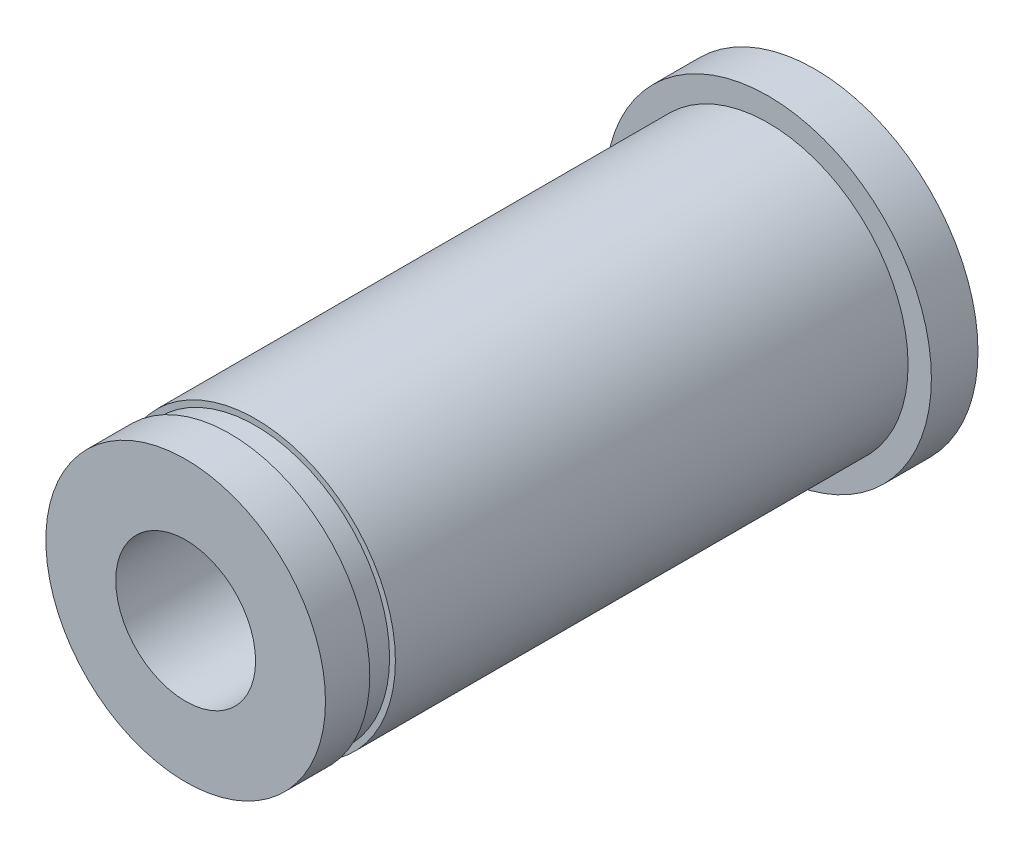
ISO-10303-21;
HEADER;
FILE_DESCRIPTION(('STEP AP214'),'2;1');
FILE_NAME('part.step','',(''),(''),'','','');
FILE_SCHEMA(('AUTOMOTIVE_DESIGN { 1 0 10303 214 1 1 1 1 }'));
ENDSEC;
DATA;
#1=APPLICATION_CONTEXT('core data for automotive mechanical design processes');
#2=APPLICATION_PROTOCOL_DEFINITION('international standard','automotive_design',2000,#1);
#3=PRODUCT_CONTEXT('',#1,'mechanical');
#4=PRODUCT('Part','Part','',(#3));
#5=PRODUCT_RELATED_PRODUCT_CATEGORY('part','',(#4));
#6=PRODUCT_DEFINITION_FORMATION('','',#4);
#7=PRODUCT_DEFINITION_CONTEXT('part definition',#1,'design');
#8=PRODUCT_DEFINITION('design','',#6,#7);
#9=PRODUCT_DEFINITION_SHAPE('','',#8);
#10=(LENGTH_UNIT() NAMED_UNIT(*) SI_UNIT(.MILLI.,.METRE.));
#11=(NAMED_UNIT(*) PLANE_ANGLE_UNIT() SI_UNIT($,.RADIAN.));
#12=(NAMED_UNIT(*) SI_UNIT($,.STERADIAN.) SOLID_ANGLE_UNIT());
#13=UNCERTAINTY_MEASURE_WITH_UNIT(LENGTH_MEASURE(1.E-05),#10,'distance_accuracy_value','');
#14=(GEOMETRIC_REPRESENTATION_CONTEXT(3) GLOBAL_UNCERTAINTY_ASSIGNED_CONTEXT((#13)) GLOBAL_UNIT_ASSIGNED_CONTEXT((#10,
#11,#12)) REPRESENTATION_CONTEXT('',''));
#15=CARTESIAN_POINT('',(0.,0.,0.));
#16=DIRECTION('',(0.,0.,1.));
#17=DIRECTION('',(1.,0.,0.));
#18=AXIS2_PLACEMENT_3D('',#15,#16,#17);
#19=CARTESIAN_POINT('',(0.,0.,25.));
#20=DIRECTION('',(0.,0.,-1.));
#21=DIRECTION('',(-1.,0.,0.));
#22=AXIS2_PLACEMENT_3D('',#19,#20,#21);
#23=CYLINDRICAL_SURFACE('',#22,6.);
#24=CARTESIAN_POINT('',(0.,0.,0.));
#25=DIRECTION('',(0.,0.,1.));
#26=DIRECTION('',(1.,0.,0.));
#27=AXIS2_PLACEMENT_3D('',#24,#25,#26);
#28=CIRCLE('',#27,6.);
#29=CARTESIAN_POINT('',(6.,0.,0.));
#30=VERTEX_POINT('',#29);
#31=EDGE_CURVE('E40',#30,#30,#28,.T.);
#32=ORIENTED_EDGE('',*,*,#31,.T.);
#33=EDGE_LOOP('',(#32));
#34=FACE_BOUND('',#33,.T.);
#35=CARTESIAN_POINT('',(0.,0.,22.));
#36=DIRECTION('',(0.,0.,1.));
#37=DIRECTION('',(1.,0.,0.));
#38=AXIS2_PLACEMENT_3D('',#35,#36,#37);
#39=CIRCLE('',#38,6.);
#40=CARTESIAN_POINT('',(6.,0.,22.));
#41=VERTEX_POINT('',#40);
#42=EDGE_CURVE('E61',#41,#41,#39,.T.);
#43=ORIENTED_EDGE('',*,*,#42,.F.);
#44=EDGE_LOOP('',(#43));
#45=FACE_BOUND('',#44,.T.);
#46=ADVANCED_FACE('F32',(#34,#45),#23,.T.);
#47=CARTESIAN_POINT('',(0.,0.,-2.));
#48=DIRECTION('',(0.,0.,1.));
#49=DIRECTION('',(1.,0.,0.));
#50=AXIS2_PLACEMENT_3D('',#47,#48,#49);
#51=CYLINDRICAL_SURFACE('',#50,7.);
#52=CARTESIAN_POINT('',(0.,0.,-2.));
#53=DIRECTION('',(0.,0.,-1.));
#54=DIRECTION('',(-1.,0.,0.));
#55=AXIS2_PLACEMENT_3D('',#52,#53,#54);
#56=CIRCLE('',#55,7.);
#57=CARTESIAN_POINT('',(-7.,0.,-2.));
#58=VERTEX_POINT('',#57);
#59=EDGE_CURVE('E45',#58,#58,#56,.T.);
#60=ORIENTED_EDGE('',*,*,#59,.F.);
#61=EDGE_LOOP('',(#60));
#62=FACE_BOUND('',#61,.T.);
#63=CARTESIAN_POINT('',(0.,0.,0.));
#64=DIRECTION('',(0.,0.,-1.));
#65=DIRECTION('',(-1.,0.,0.));
#66=AXIS2_PLACEMENT_3D('',#63,#64,#65);
#67=CIRCLE('',#66,7.);
#68=CARTESIAN_POINT('',(-7.,0.,0.));
#69=VERTEX_POINT('',#68);
#70=EDGE_CURVE('E47',#69,#69,#67,.T.);
#71=ORIENTED_EDGE('',*,*,#70,.T.);
#72=EDGE_LOOP('',(#71));
#73=FACE_BOUND('',#72,.T.);
#74=ADVANCED_FACE('F86',(#62,#73),#51,.T.);
#75=CARTESIAN_POINT('',(0.,0.,-2.));
#76=DIRECTION('',(0.,0.,-1.));
#77=DIRECTION('',(-1.,0.,0.));
#78=AXIS2_PLACEMENT_3D('',#75,#76,#77);
#79=PLANE('',#78);
#80=CARTESIAN_POINT('',(0.,0.,-2.));
#81=DIRECTION('',(0.,0.,-1.));
#82=DIRECTION('',(-1.,0.,0.));
#83=AXIS2_PLACEMENT_3D('',#80,#81,#82);
#84=CIRCLE('',#83,3.);
#85=CARTESIAN_POINT('',(-3.,0.,-2.));
#86=VERTEX_POINT('',#85);
#87=EDGE_CURVE('E64',#86,#86,#84,.T.);
#88=ORIENTED_EDGE('',*,*,#87,.F.);
#89=EDGE_LOOP('',(#88));
#90=FACE_BOUND('',#89,.T.);
#91=ORIENTED_EDGE('',*,*,#59,.T.);
#92=EDGE_LOOP('',(#91));
#93=FACE_BOUND('',#92,.T.);
#94=ADVANCED_FACE('F91',(#90,#93),#79,.T.);
#95=CARTESIAN_POINT('',(0.,0.,0.));
#96=DIRECTION('',(0.,0.,-1.));
#97=DIRECTION('',(-1.,0.,0.));
#98=AXIS2_PLACEMENT_3D('',#95,#96,#97);
#99=PLANE('',#98);
#100=ORIENTED_EDGE('',*,*,#31,.F.);
#101=EDGE_LOOP('',(#100));
#102=FACE_BOUND('',#101,.T.);
#103=ORIENTED_EDGE('',*,*,#70,.F.);
#104=EDGE_LOOP('',(#103));
#105=FACE_BOUND('',#104,.T.);
#106=ADVANCED_FACE('F107',(#102,#105),#99,.F.);
#107=CARTESIAN_POINT('',(-6.,0.,23.1));
#108=DIRECTION('',(0.,0.,-1.));
#109=DIRECTION('',(-1.,0.,0.));
#110=AXIS2_PLACEMENT_3D('',#107,#108,#109);
#111=PLANE('',#110);
#112=CARTESIAN_POINT('',(0.,0.,23.1));
#113=DIRECTION('',(0.,0.,1.));
#114=DIRECTION('',(1.,0.,0.));
#115=AXIS2_PLACEMENT_3D('',#112,#113,#114);
#116=CIRCLE('',#115,5.75);
#117=CARTESIAN_POINT('',(5.75,0.,23.1));
#118=VERTEX_POINT('',#117);
#119=EDGE_CURVE('E55',#118,#118,#116,.T.);
#120=ORIENTED_EDGE('',*,*,#119,.T.);
#121=EDGE_LOOP('',(#120));
#122=FACE_BOUND('',#121,.T.);
#123=CARTESIAN_POINT('',(0.,0.,23.1));
#124=DIRECTION('',(0.,0.,1.));
#125=DIRECTION('',(1.,0.,0.));
#126=AXIS2_PLACEMENT_3D('',#123,#124,#125);
#127=CIRCLE('',#126,6.);
#128=CARTESIAN_POINT('',(6.,0.,23.1));
#129=VERTEX_POINT('',#128);
#130=EDGE_CURVE('E50',#129,#129,#127,.T.);
#131=ORIENTED_EDGE('',*,*,#130,.F.);
#132=EDGE_LOOP('',(#131));
#133=FACE_BOUND('',#132,.T.);
#134=ADVANCED_FACE('F101',(#122,#133),#111,.T.);
#135=CARTESIAN_POINT('',(0.,0.,25.));
#136=DIRECTION('',(0.,0.,1.));
#137=DIRECTION('',(1.,0.,0.));
#138=AXIS2_PLACEMENT_3D('',#135,#136,#137);
#139=CYLINDRICAL_SURFACE('',#138,5.75);
#140=CARTESIAN_POINT('',(0.,0.,22.));
#141=DIRECTION('',(0.,0.,1.));
#142=DIRECTION('',(1.,0.,0.));
#143=AXIS2_PLACEMENT_3D('',#140,#141,#142);
#144=CIRCLE('',#143,5.75);
#145=CARTESIAN_POINT('',(5.75,0.,22.));
#146=VERTEX_POINT('',#145);
#147=EDGE_CURVE('E58',#146,#146,#144,.T.);
#148=ORIENTED_EDGE('',*,*,#147,.T.);
#149=EDGE_LOOP('',(#148));
#150=FACE_BOUND('',#149,.T.);
#151=ORIENTED_EDGE('',*,*,#119,.F.);
#152=EDGE_LOOP('',(#151));
#153=FACE_BOUND('',#152,.T.);
#154=ADVANCED_FACE('F81',(#150,#153),#139,.T.);
#155=CARTESIAN_POINT('',(-6.,0.,22.));
#156=DIRECTION('',(0.,0.,1.));
#157=DIRECTION('',(1.,0.,0.));
#158=AXIS2_PLACEMENT_3D('',#155,#156,#157);
#159=PLANE('',#158);
#160=ORIENTED_EDGE('',*,*,#42,.T.);
#161=EDGE_LOOP('',(#160));
#162=FACE_BOUND('',#161,.T.);
#163=ORIENTED_EDGE('',*,*,#147,.F.);
#164=EDGE_LOOP('',(#163));
#165=FACE_BOUND('',#164,.T.);
#166=ADVANCED_FACE('F75',(#162,#165),#159,.T.);
#167=CARTESIAN_POINT('',(0.,0.,25.));
#168=DIRECTION('',(0.,0.,1.));
#169=DIRECTION('',(1.,0.,0.));
#170=AXIS2_PLACEMENT_3D('',#167,#168,#169);
#171=PLANE('',#170);
#172=CARTESIAN_POINT('',(0.,0.,25.));
#173=DIRECTION('',(0.,0.,1.));
#174=DIRECTION('',(1.,0.,0.));
#175=AXIS2_PLACEMENT_3D('',#172,#173,#174);
#176=CIRCLE('',#175,3.);
#177=CARTESIAN_POINT('',(3.,0.,25.));
#178=VERTEX_POINT('',#177);
#179=EDGE_CURVE('E36',#178,#178,#176,.T.);
#180=ORIENTED_EDGE('',*,*,#179,.F.);
#181=EDGE_LOOP('',(#180));
#182=FACE_BOUND('',#181,.T.);
#183=CARTESIAN_POINT('',(0.,0.,25.));
#184=DIRECTION('',(0.,0.,1.));
#185=DIRECTION('',(1.,0.,0.));
#186=AXIS2_PLACEMENT_3D('',#183,#184,#185);
#187=CIRCLE('',#186,6.);
#188=CARTESIAN_POINT('',(6.,0.,25.));
#189=VERTEX_POINT('',#188);
#190=EDGE_CURVE('E10',#189,#189,#187,.T.);
#191=ORIENTED_EDGE('',*,*,#190,.T.);
#192=EDGE_LOOP('',(#191));
#193=FACE_BOUND('',#192,.T.);
#194=ADVANCED_FACE('F73',(#182,#193),#171,.T.);
#195=ORIENTED_EDGE('',*,*,#190,.F.);
#196=EDGE_LOOP('',(#195));
#197=FACE_BOUND('',#196,.T.);
#198=ORIENTED_EDGE('',*,*,#130,.T.);
#199=EDGE_LOOP('',(#198));
#200=FACE_BOUND('',#199,.T.);
#201=ADVANCED_FACE('F34',(#197,#200),#23,.T.);
#202=CARTESIAN_POINT('',(0.,0.,26.));
#203=DIRECTION('',(0.,0.,-1.));
#204=DIRECTION('',(-1.,0.,0.));
#205=AXIS2_PLACEMENT_3D('',#202,#203,#204);
#206=CYLINDRICAL_SURFACE('',#205,3.);
#207=ORIENTED_EDGE('',*,*,#179,.T.);
#208=EDGE_LOOP('',(#207));
#209=FACE_BOUND('',#208,.T.);
#210=ORIENTED_EDGE('',*,*,#87,.T.);
#211=EDGE_LOOP('',(#210));
#212=FACE_BOUND('',#211,.T.);
#213=ADVANCED_FACE('F71',(#209,#212),#206,.F.);
#214=CLOSED_SHELL('',(#46,#74,#94,#106,#134,#154,#166,#194,#201,#213));
#215=MANIFOLD_SOLID_BREP('B2',#214);
#216=ADVANCED_BREP_SHAPE_REPRESENTATION('',(#18,#215),#14);
#217=SHAPE_DEFINITION_REPRESENTATION(#9,#216);
ENDSEC;
END-ISO-10303-21;
